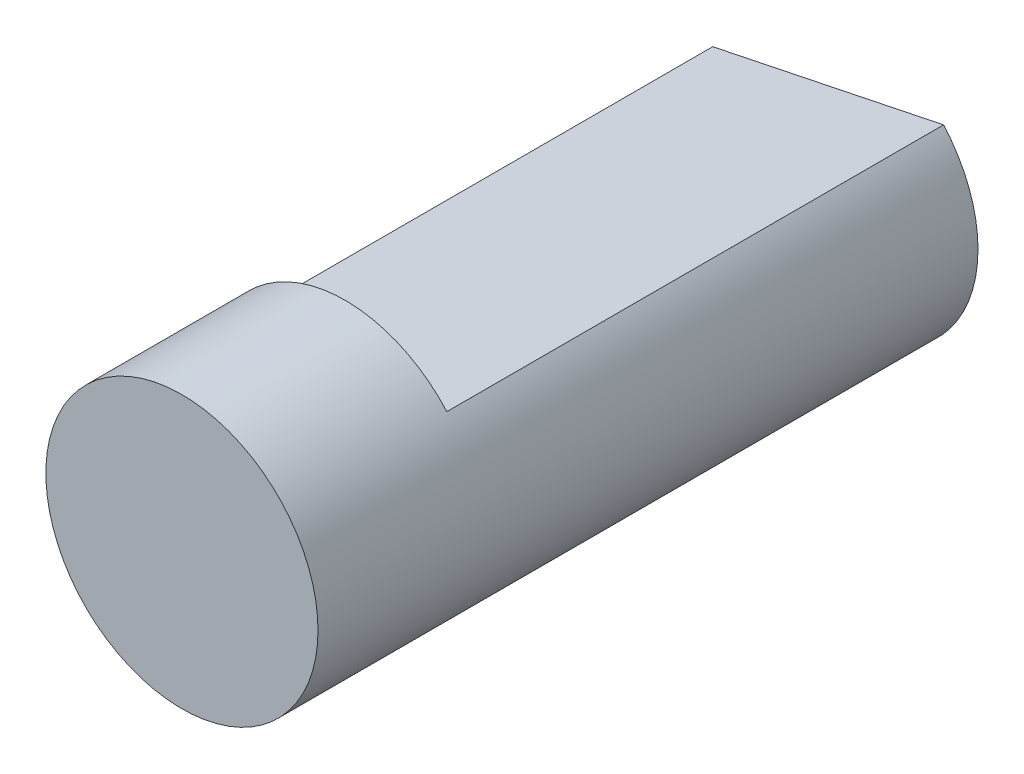
ISO-10303-21;
HEADER;
FILE_DESCRIPTION(('STEP AP214'),'2;1');
FILE_NAME('part.step','',(''),(''),'','','');
FILE_SCHEMA(('AUTOMOTIVE_DESIGN { 1 0 10303 214 1 1 1 1 }'));
ENDSEC;
DATA;
#1=APPLICATION_CONTEXT('core data for automotive mechanical design processes');
#2=APPLICATION_PROTOCOL_DEFINITION('international standard','automotive_design',2000,#1);
#3=PRODUCT_CONTEXT('',#1,'mechanical');
#4=PRODUCT('Part','Part','',(#3));
#5=PRODUCT_RELATED_PRODUCT_CATEGORY('part','',(#4));
#6=PRODUCT_DEFINITION_FORMATION('','',#4);
#7=PRODUCT_DEFINITION_CONTEXT('part definition',#1,'design');
#8=PRODUCT_DEFINITION('design','',#6,#7);
#9=PRODUCT_DEFINITION_SHAPE('','',#8);
#10=(LENGTH_UNIT() NAMED_UNIT(*) SI_UNIT(.MILLI.,.METRE.));
#11=(NAMED_UNIT(*) PLANE_ANGLE_UNIT() SI_UNIT($,.RADIAN.));
#12=(NAMED_UNIT(*) SI_UNIT($,.STERADIAN.) SOLID_ANGLE_UNIT());
#13=UNCERTAINTY_MEASURE_WITH_UNIT(LENGTH_MEASURE(1.E-05),#10,'distance_accuracy_value','');
#14=(GEOMETRIC_REPRESENTATION_CONTEXT(3) GLOBAL_UNCERTAINTY_ASSIGNED_CONTEXT((#13)) GLOBAL_UNIT_ASSIGNED_CONTEXT((#10,
#11,#12)) REPRESENTATION_CONTEXT('',''));
#15=CARTESIAN_POINT('',(0.,0.,0.));
#16=DIRECTION('',(0.,0.,1.));
#17=DIRECTION('',(1.,0.,0.));
#18=AXIS2_PLACEMENT_3D('',#15,#16,#17);
#19=CARTESIAN_POINT('',(0.,0.,-2.4));
#20=DIRECTION('',(0.,0.,1.));
#21=DIRECTION('',(1.,0.,0.));
#22=AXIS2_PLACEMENT_3D('',#19,#20,#21);
#23=PLANE('',#22);
#24=DIRECTION('',(0.979320361088485,0.202315670074067,0.));
#25=VECTOR('',#24,1.);
#26=CARTESIAN_POINT('',(-0.202315670074067,0.979320361088485,-2.4));
#27=LINE('',#26,#25);
#28=CARTESIAN_POINT('',(-1.89854829236602,0.62889934135286,-2.4));
#29=VERTEX_POINT('',#28);
#30=CARTESIAN_POINT('',(1.49391695221789,1.32974138082411,-2.4));
#31=VERTEX_POINT('',#30);
#32=EDGE_CURVE('E60',#29,#31,#27,.T.);
#33=ORIENTED_EDGE('',*,*,#32,.F.);
#34=CARTESIAN_POINT('',(0.,0.,-2.4));
#35=DIRECTION('',(0.,0.,1.));
#36=DIRECTION('',(1.,0.,0.));
#37=AXIS2_PLACEMENT_3D('',#34,#35,#36);
#38=CIRCLE('',#37,2.);
#39=EDGE_CURVE('E11',#31,#29,#38,.T.);
#40=ORIENTED_EDGE('',*,*,#39,.F.);
#41=EDGE_LOOP('',(#33,#40));
#42=FACE_BOUND('',#41,.T.);
#43=ADVANCED_FACE('F45',(#42),#23,.F.);
#44=CARTESIAN_POINT('',(0.,0.,-2.4));
#45=DIRECTION('',(0.,0.,1.));
#46=DIRECTION('',(1.,0.,0.));
#47=AXIS2_PLACEMENT_3D('',#44,#45,#46);
#48=CYLINDRICAL_SURFACE('',#47,2.);
#49=ORIENTED_EDGE('',*,*,#39,.T.);
#50=DIRECTION('',(0.,0.,1.));
#51=VECTOR('',#50,1.);
#52=CARTESIAN_POINT('',(-1.89854829236602,0.62889934135286,-9.7));
#53=LINE('',#52,#51);
#54=CARTESIAN_POINT('',(-1.89854829236602,0.62889934135286,-9.7));
#55=VERTEX_POINT('',#54);
#56=EDGE_CURVE('E79',#55,#29,#53,.T.);
#57=ORIENTED_EDGE('',*,*,#56,.F.);
#58=CARTESIAN_POINT('',(0.,0.,-9.7));
#59=DIRECTION('',(0.,0.,-1.));
#60=DIRECTION('',(-1.,0.,0.));
#61=AXIS2_PLACEMENT_3D('',#58,#59,#60);
#62=CIRCLE('',#61,2.);
#63=CARTESIAN_POINT('',(1.49391695221789,1.32974138082411,-9.7));
#64=VERTEX_POINT('',#63);
#65=EDGE_CURVE('E81',#64,#55,#62,.T.);
#66=ORIENTED_EDGE('',*,*,#65,.F.);
#67=DIRECTION('',(0.,0.,1.));
#68=VECTOR('',#67,1.);
#69=CARTESIAN_POINT('',(1.49391695221789,1.32974138082411,-9.7));
#70=LINE('',#69,#68);
#71=EDGE_CURVE('E77',#64,#31,#70,.T.);
#72=ORIENTED_EDGE('',*,*,#71,.T.);
#73=EDGE_LOOP('',(#49,#57,#66,#72));
#74=FACE_BOUND('',#73,.T.);
#75=CARTESIAN_POINT('',(0.,0.,0.));
#76=DIRECTION('',(0.,0.,1.));
#77=DIRECTION('',(1.,0.,0.));
#78=AXIS2_PLACEMENT_3D('',#75,#76,#77);
#79=CIRCLE('',#78,2.);
#80=CARTESIAN_POINT('',(2.,0.,0.));
#81=VERTEX_POINT('',#80);
#82=EDGE_CURVE('E49',#81,#81,#79,.T.);
#83=ORIENTED_EDGE('',*,*,#82,.F.);
#84=EDGE_LOOP('',(#83));
#85=FACE_BOUND('',#84,.T.);
#86=ADVANCED_FACE('F47',(#74,#85),#48,.T.);
#87=CARTESIAN_POINT('',(0.,0.,0.));
#88=DIRECTION('',(0.,0.,1.));
#89=DIRECTION('',(1.,0.,0.));
#90=AXIS2_PLACEMENT_3D('',#87,#88,#89);
#91=PLANE('',#90);
#92=ORIENTED_EDGE('',*,*,#82,.T.);
#93=EDGE_LOOP('',(#92));
#94=FACE_BOUND('',#93,.T.);
#95=ADVANCED_FACE('F97',(#94),#91,.T.);
#96=CARTESIAN_POINT('',(-0.202315670074067,0.979320361088485,-9.7));
#97=DIRECTION('',(0.202315670074067,-0.979320361088485,0.));
#98=DIRECTION('',(0.979320361088485,0.202315670074067,0.));
#99=AXIS2_PLACEMENT_3D('',#96,#97,#98);
#100=PLANE('',#99);
#101=ORIENTED_EDGE('',*,*,#32,.T.);
#102=ORIENTED_EDGE('',*,*,#71,.F.);
#103=DIRECTION('',(0.979320361088485,0.202315670074067,0.));
#104=VECTOR('',#103,1.);
#105=CARTESIAN_POINT('',(-0.202315670074067,0.979320361088485,-9.7));
#106=LINE('',#105,#104);
#107=EDGE_CURVE('E67',#55,#64,#106,.T.);
#108=ORIENTED_EDGE('',*,*,#107,.F.);
#109=ORIENTED_EDGE('',*,*,#56,.T.);
#110=EDGE_LOOP('',(#101,#102,#108,#109));
#111=FACE_BOUND('',#110,.T.);
#112=ADVANCED_FACE('F76',(#111),#100,.F.);
#113=CARTESIAN_POINT('',(0.,0.,-9.7));
#114=DIRECTION('',(0.,0.,-1.));
#115=DIRECTION('',(-1.,0.,0.));
#116=AXIS2_PLACEMENT_3D('',#113,#114,#115);
#117=PLANE('',#116);
#118=ORIENTED_EDGE('',*,*,#65,.T.);
#119=ORIENTED_EDGE('',*,*,#107,.T.);
#120=EDGE_LOOP('',(#118,#119));
#121=FACE_BOUND('',#120,.T.);
#122=ADVANCED_FACE('F92',(#121),#117,.T.);
#123=CLOSED_SHELL('',(#43,#86,#95,#112,#122));
#124=MANIFOLD_SOLID_BREP('B2',#123);
#125=ADVANCED_BREP_SHAPE_REPRESENTATION('',(#18,#124),#14);
#126=SHAPE_DEFINITION_REPRESENTATION(#9,#125);
ENDSEC;
END-ISO-10303-21;
